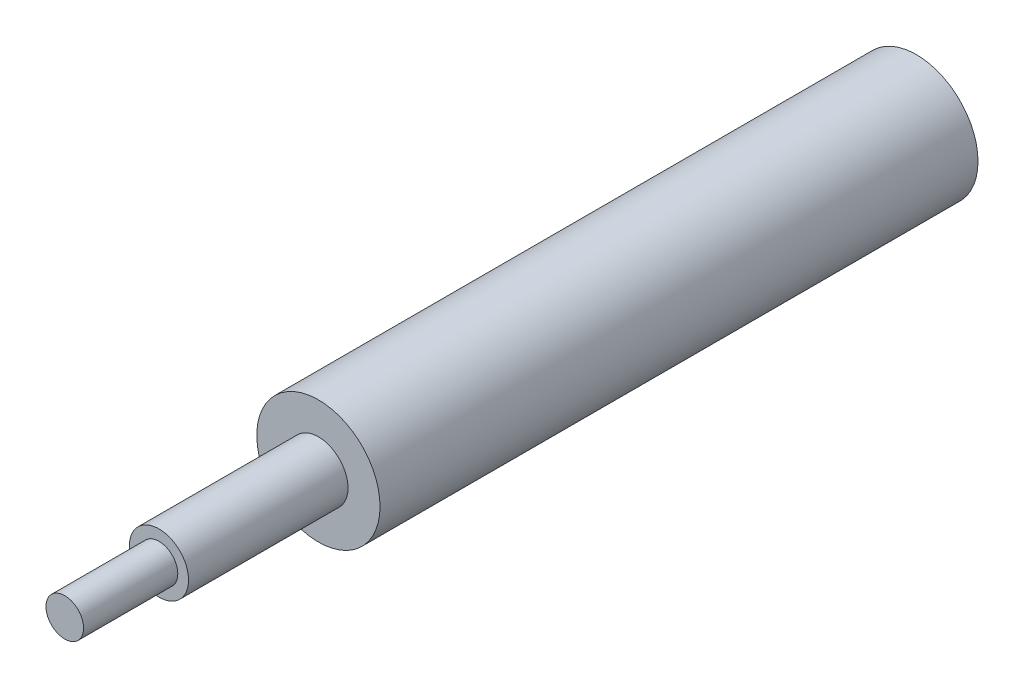
ISO-10303-21;
HEADER;
FILE_DESCRIPTION(('STEP AP214'),'2;1');
FILE_NAME('part.step','',(''),(''),'','','');
FILE_SCHEMA(('AUTOMOTIVE_DESIGN { 1 0 10303 214 1 1 1 1 }'));
ENDSEC;
DATA;
#1=APPLICATION_CONTEXT('core data for automotive mechanical design processes');
#2=APPLICATION_PROTOCOL_DEFINITION('international standard','automotive_design',2000,#1);
#3=PRODUCT_CONTEXT('',#1,'mechanical');
#4=PRODUCT('Part','Part','',(#3));
#5=PRODUCT_RELATED_PRODUCT_CATEGORY('part','',(#4));
#6=PRODUCT_DEFINITION_FORMATION('','',#4);
#7=PRODUCT_DEFINITION_CONTEXT('part definition',#1,'design');
#8=PRODUCT_DEFINITION('design','',#6,#7);
#9=PRODUCT_DEFINITION_SHAPE('','',#8);
#10=(LENGTH_UNIT() NAMED_UNIT(*) SI_UNIT(.MILLI.,.METRE.));
#11=(NAMED_UNIT(*) PLANE_ANGLE_UNIT() SI_UNIT($,.RADIAN.));
#12=(NAMED_UNIT(*) SI_UNIT($,.STERADIAN.) SOLID_ANGLE_UNIT());
#13=UNCERTAINTY_MEASURE_WITH_UNIT(LENGTH_MEASURE(1.E-05),#10,'distance_accuracy_value','');
#14=(GEOMETRIC_REPRESENTATION_CONTEXT(3) GLOBAL_UNCERTAINTY_ASSIGNED_CONTEXT((#13)) GLOBAL_UNIT_ASSIGNED_CONTEXT((#10,
#11,#12)) REPRESENTATION_CONTEXT('',''));
#15=CARTESIAN_POINT('',(0.,0.,0.));
#16=DIRECTION('',(0.,0.,1.));
#17=DIRECTION('',(1.,0.,0.));
#18=AXIS2_PLACEMENT_3D('',#15,#16,#17);
#19=CARTESIAN_POINT('',(0.,0.,95.25));
#20=DIRECTION('',(0.,0.,-1.));
#21=DIRECTION('',(-1.,0.,0.));
#22=AXIS2_PLACEMENT_3D('',#19,#20,#21);
#23=CYLINDRICAL_SURFACE('',#22,9.8171);
#24=CARTESIAN_POINT('',(0.,0.,95.25));
#25=DIRECTION('',(0.,0.,1.));
#26=DIRECTION('',(1.,0.,0.));
#27=AXIS2_PLACEMENT_3D('',#24,#25,#26);
#28=CIRCLE('',#27,9.8171);
#29=CARTESIAN_POINT('',(9.8171,0.,95.25));
#30=VERTEX_POINT('',#29);
#31=EDGE_CURVE('E45',#30,#30,#28,.T.);
#32=ORIENTED_EDGE('',*,*,#31,.F.);
#33=EDGE_LOOP('',(#32));
#34=FACE_BOUND('',#33,.T.);
#35=CARTESIAN_POINT('',(0.,0.,0.));
#36=DIRECTION('',(0.,0.,1.));
#37=DIRECTION('',(1.,0.,0.));
#38=AXIS2_PLACEMENT_3D('',#35,#36,#37);
#39=CIRCLE('',#38,9.8171);
#40=CARTESIAN_POINT('',(9.8171,0.,0.));
#41=VERTEX_POINT('',#40);
#42=EDGE_CURVE('E36',#41,#41,#39,.T.);
#43=ORIENTED_EDGE('',*,*,#42,.T.);
#44=EDGE_LOOP('',(#43));
#45=FACE_BOUND('',#44,.T.);
#46=ADVANCED_FACE('F33',(#34,#45),#23,.T.);
#47=CARTESIAN_POINT('',(0.,0.,95.25));
#48=DIRECTION('',(0.,0.,1.));
#49=DIRECTION('',(1.,0.,0.));
#50=AXIS2_PLACEMENT_3D('',#47,#48,#49);
#51=PLANE('',#50);
#52=CARTESIAN_POINT('',(0.,0.,95.25));
#53=DIRECTION('',(0.,0.,1.));
#54=DIRECTION('',(1.,0.,0.));
#55=AXIS2_PLACEMENT_3D('',#52,#53,#54);
#56=CIRCLE('',#55,4.7125);
#57=CARTESIAN_POINT('',(4.7125,0.,95.25));
#58=VERTEX_POINT('',#57);
#59=EDGE_CURVE('E40',#58,#58,#56,.T.);
#60=ORIENTED_EDGE('',*,*,#59,.F.);
#61=EDGE_LOOP('',(#60));
#62=FACE_BOUND('',#61,.T.);
#63=ORIENTED_EDGE('',*,*,#31,.T.);
#64=EDGE_LOOP('',(#63));
#65=FACE_BOUND('',#64,.T.);
#66=ADVANCED_FACE('F62',(#62,#65),#51,.T.);
#67=CARTESIAN_POINT('',(0.,0.,0.));
#68=DIRECTION('',(0.,0.,1.));
#69=DIRECTION('',(1.,0.,0.));
#70=AXIS2_PLACEMENT_3D('',#67,#68,#69);
#71=PLANE('',#70);
#72=ORIENTED_EDGE('',*,*,#42,.F.);
#73=EDGE_LOOP('',(#72));
#74=FACE_BOUND('',#73,.T.);
#75=ADVANCED_FACE('F59',(#74),#71,.F.);
#76=CARTESIAN_POINT('',(0.,0.,120.65));
#77=DIRECTION('',(0.,0.,-1.));
#78=DIRECTION('',(-1.,0.,0.));
#79=AXIS2_PLACEMENT_3D('',#76,#77,#78);
#80=CYLINDRICAL_SURFACE('',#79,4.7125);
#81=CARTESIAN_POINT('',(0.,0.,120.65));
#82=DIRECTION('',(0.,0.,1.));
#83=DIRECTION('',(1.,0.,0.));
#84=AXIS2_PLACEMENT_3D('',#81,#82,#83);
#85=CIRCLE('',#84,4.7125);
#86=CARTESIAN_POINT('',(4.7125,0.,120.65));
#87=VERTEX_POINT('',#86);
#88=EDGE_CURVE('E50',#87,#87,#85,.T.);
#89=ORIENTED_EDGE('',*,*,#88,.F.);
#90=EDGE_LOOP('',(#89));
#91=FACE_BOUND('',#90,.T.);
#92=ORIENTED_EDGE('',*,*,#59,.T.);
#93=EDGE_LOOP('',(#92));
#94=FACE_BOUND('',#93,.T.);
#95=ADVANCED_FACE('F61',(#91,#94),#80,.T.);
#96=CARTESIAN_POINT('',(0.,0.,120.65));
#97=DIRECTION('',(0.,0.,1.));
#98=DIRECTION('',(1.,0.,0.));
#99=AXIS2_PLACEMENT_3D('',#96,#97,#98);
#100=PLANE('',#99);
#101=CARTESIAN_POINT('',(0.,0.,120.65));
#102=DIRECTION('',(0.,0.,1.));
#103=DIRECTION('',(1.,0.,0.));
#104=AXIS2_PLACEMENT_3D('',#101,#102,#103);
#105=CIRCLE('',#104,3.);
#106=CARTESIAN_POINT('',(3.,0.,120.65));
#107=VERTEX_POINT('',#106);
#108=EDGE_CURVE('E10',#107,#107,#105,.T.);
#109=ORIENTED_EDGE('',*,*,#108,.F.);
#110=EDGE_LOOP('',(#109));
#111=FACE_BOUND('',#110,.T.);
#112=ORIENTED_EDGE('',*,*,#88,.T.);
#113=EDGE_LOOP('',(#112));
#114=FACE_BOUND('',#113,.T.);
#115=ADVANCED_FACE('F67',(#111,#114),#100,.T.);
#116=CARTESIAN_POINT('',(0.,0.,135.65));
#117=DIRECTION('',(0.,0.,-1.));
#118=DIRECTION('',(-1.,0.,0.));
#119=AXIS2_PLACEMENT_3D('',#116,#117,#118);
#120=CYLINDRICAL_SURFACE('',#119,3.);
#121=CARTESIAN_POINT('',(0.,0.,135.65));
#122=DIRECTION('',(0.,0.,1.));
#123=DIRECTION('',(1.,0.,0.));
#124=AXIS2_PLACEMENT_3D('',#121,#122,#123);
#125=CIRCLE('',#124,3.);
#126=CARTESIAN_POINT('',(3.,0.,135.65));
#127=VERTEX_POINT('',#126);
#128=EDGE_CURVE('E49',#127,#127,#125,.T.);
#129=ORIENTED_EDGE('',*,*,#128,.F.);
#130=EDGE_LOOP('',(#129));
#131=FACE_BOUND('',#130,.T.);
#132=ORIENTED_EDGE('',*,*,#108,.T.);
#133=EDGE_LOOP('',(#132));
#134=FACE_BOUND('',#133,.T.);
#135=ADVANCED_FACE('F97',(#131,#134),#120,.T.);
#136=CARTESIAN_POINT('',(0.,0.,135.65));
#137=DIRECTION('',(0.,0.,1.));
#138=DIRECTION('',(1.,0.,0.));
#139=AXIS2_PLACEMENT_3D('',#136,#137,#138);
#140=PLANE('',#139);
#141=ORIENTED_EDGE('',*,*,#128,.T.);
#142=EDGE_LOOP('',(#141));
#143=FACE_BOUND('',#142,.T.);
#144=ADVANCED_FACE('F107',(#143),#140,.T.);
#145=CLOSED_SHELL('',(#46,#66,#75,#95,#115,#135,#144));
#146=MANIFOLD_SOLID_BREP('B2',#145);
#147=ADVANCED_BREP_SHAPE_REPRESENTATION('',(#18,#146),#14);
#148=SHAPE_DEFINITION_REPRESENTATION(#9,#147);
ENDSEC;
END-ISO-10303-21;
